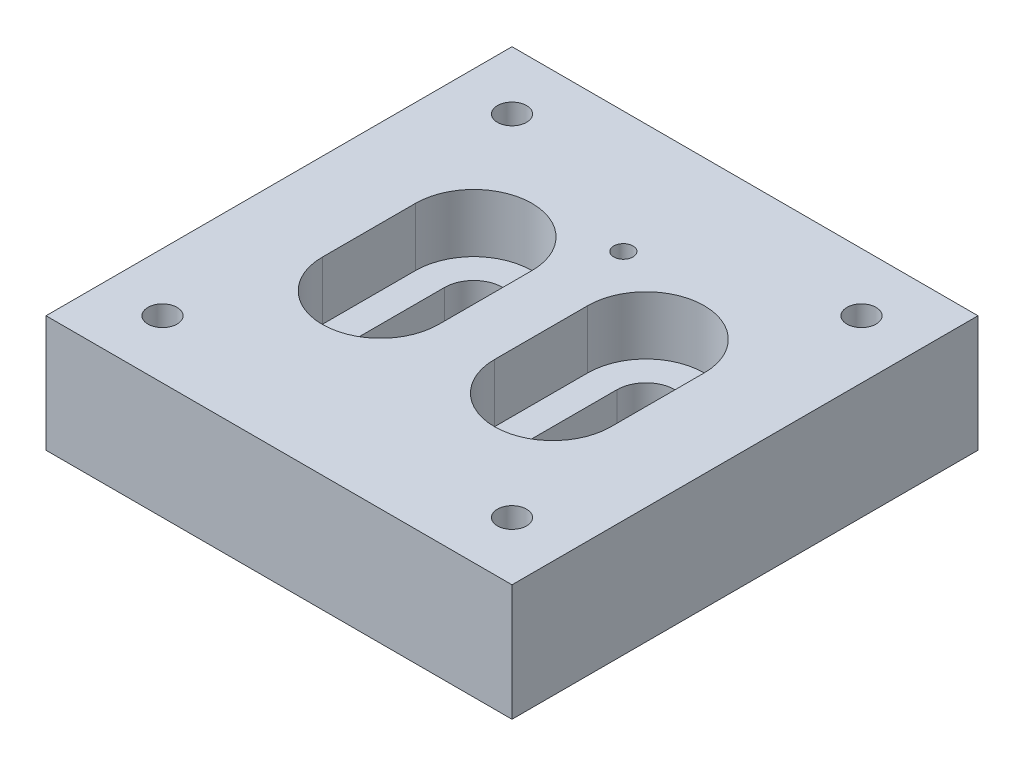
ISO-10303-21;
HEADER;
FILE_DESCRIPTION(('STEP AP214'),'2;1');
FILE_NAME('part.step','',(''),(''),'','','');
FILE_SCHEMA(('AUTOMOTIVE_DESIGN { 1 0 10303 214 1 1 1 1 }'));
ENDSEC;
DATA;
#1=APPLICATION_CONTEXT('core data for automotive mechanical design processes');
#2=APPLICATION_PROTOCOL_DEFINITION('international standard','automotive_design',2000,#1);
#3=PRODUCT_CONTEXT('',#1,'mechanical');
#4=PRODUCT('Part','Part','',(#3));
#5=PRODUCT_RELATED_PRODUCT_CATEGORY('part','',(#4));
#6=PRODUCT_DEFINITION_FORMATION('','',#4);
#7=PRODUCT_DEFINITION_CONTEXT('part definition',#1,'design');
#8=PRODUCT_DEFINITION('design','',#6,#7);
#9=PRODUCT_DEFINITION_SHAPE('','',#8);
#10=(LENGTH_UNIT() NAMED_UNIT(*) SI_UNIT(.MILLI.,.METRE.));
#11=(NAMED_UNIT(*) PLANE_ANGLE_UNIT() SI_UNIT($,.RADIAN.));
#12=(NAMED_UNIT(*) SI_UNIT($,.STERADIAN.) SOLID_ANGLE_UNIT());
#13=UNCERTAINTY_MEASURE_WITH_UNIT(LENGTH_MEASURE(1.E-05),#10,'distance_accuracy_value','');
#14=(GEOMETRIC_REPRESENTATION_CONTEXT(3) GLOBAL_UNCERTAINTY_ASSIGNED_CONTEXT((#13)) GLOBAL_UNIT_ASSIGNED_CONTEXT((#10,
#11,#12)) REPRESENTATION_CONTEXT('',''));
#15=CARTESIAN_POINT('',(0.,0.,0.));
#16=DIRECTION('',(0.,0.,1.));
#17=DIRECTION('',(1.,0.,0.));
#18=AXIS2_PLACEMENT_3D('',#15,#16,#17);
#19=CARTESIAN_POINT('',(0.,20.,0.));
#20=DIRECTION('',(0.,1.,0.));
#21=DIRECTION('',(0.,0.,1.));
#22=AXIS2_PLACEMENT_3D('',#19,#20,#21);
#23=PLANE('',#22);
#24=CARTESIAN_POINT('',(0.,20.,-19.1180830180548));
#25=DIRECTION('',(0.,1.,0.));
#26=DIRECTION('',(0.,0.,1.));
#27=AXIS2_PLACEMENT_3D('',#24,#25,#26);
#28=CIRCLE('',#27,1.65);
#29=CARTESIAN_POINT('',(0.,20.,-17.4680830180548));
#30=VERTEX_POINT('',#29);
#31=EDGE_CURVE('E740',#30,#30,#28,.T.);
#32=ORIENTED_EDGE('',*,*,#31,.F.);
#33=EDGE_LOOP('',(#32));
#34=FACE_BOUND('',#33,.T.);
#35=CARTESIAN_POINT('',(-15.,20.,7.57383044519783));
#36=DIRECTION('',(0.,1.,0.));
#37=DIRECTION('',(0.,0.,1.));
#38=AXIS2_PLACEMENT_3D('',#35,#36,#37);
#39=CIRCLE('',#38,10.);
#40=CARTESIAN_POINT('',(-25.,20.,7.57383044519782));
#41=VERTEX_POINT('',#40);
#42=CARTESIAN_POINT('',(-5.,20.,7.57383044519782));
#43=VERTEX_POINT('',#42);
#44=EDGE_CURVE('E189',#41,#43,#39,.T.);
#45=ORIENTED_EDGE('',*,*,#44,.F.);
#46=DIRECTION('',(0.,0.,1.));
#47=VECTOR('',#46,1.);
#48=CARTESIAN_POINT('',(-25.,20.,-8.42616955480218));
#49=LINE('',#48,#47);
#50=CARTESIAN_POINT('',(-25.,20.,-8.42616955480218));
#51=VERTEX_POINT('',#50);
#52=EDGE_CURVE('E52',#51,#41,#49,.T.);
#53=ORIENTED_EDGE('',*,*,#52,.F.);
#54=CARTESIAN_POINT('',(-15.,20.,-8.42616955480218));
#55=DIRECTION('',(0.,1.,0.));
#56=DIRECTION('',(0.,0.,1.));
#57=AXIS2_PLACEMENT_3D('',#54,#55,#56);
#58=CIRCLE('',#57,10.);
#59=CARTESIAN_POINT('',(-5.,20.,-8.42616955480218));
#60=VERTEX_POINT('',#59);
#61=EDGE_CURVE('E198',#60,#51,#58,.T.);
#62=ORIENTED_EDGE('',*,*,#61,.F.);
#63=DIRECTION('',(0.,0.,-1.));
#64=VECTOR('',#63,1.);
#65=CARTESIAN_POINT('',(-5.,20.,7.57383044519782));
#66=LINE('',#65,#64);
#67=EDGE_CURVE('E182',#43,#60,#66,.T.);
#68=ORIENTED_EDGE('',*,*,#67,.F.);
#69=EDGE_LOOP('',(#45,#53,#62,#68));
#70=FACE_BOUND('',#69,.T.);
#71=CARTESIAN_POINT('',(15.,20.,-8.));
#72=DIRECTION('',(0.,1.,0.));
#73=DIRECTION('',(0.,0.,1.));
#74=AXIS2_PLACEMENT_3D('',#71,#72,#73);
#75=CIRCLE('',#74,10.);
#76=CARTESIAN_POINT('',(25.,20.,-8.));
#77=VERTEX_POINT('',#76);
#78=CARTESIAN_POINT('',(4.99999999999999,20.,-8.));
#79=VERTEX_POINT('',#78);
#80=EDGE_CURVE('E209',#77,#79,#75,.T.);
#81=ORIENTED_EDGE('',*,*,#80,.F.);
#82=DIRECTION('',(0.,0.,-1.));
#83=VECTOR('',#82,1.);
#84=CARTESIAN_POINT('',(25.,20.,8.));
#85=LINE('',#84,#83);
#86=CARTESIAN_POINT('',(25.,20.,8.));
#87=VERTEX_POINT('',#86);
#88=EDGE_CURVE('E60',#87,#77,#85,.T.);
#89=ORIENTED_EDGE('',*,*,#88,.F.);
#90=CARTESIAN_POINT('',(15.,20.,8.));
#91=DIRECTION('',(0.,1.,0.));
#92=DIRECTION('',(0.,0.,1.));
#93=AXIS2_PLACEMENT_3D('',#90,#91,#92);
#94=CIRCLE('',#93,10.);
#95=CARTESIAN_POINT('',(4.99999999999999,20.,8.));
#96=VERTEX_POINT('',#95);
#97=EDGE_CURVE('E266',#96,#87,#94,.T.);
#98=ORIENTED_EDGE('',*,*,#97,.F.);
#99=DIRECTION('',(0.,0.,1.));
#100=VECTOR('',#99,1.);
#101=CARTESIAN_POINT('',(4.99999999999999,20.,-8.));
#102=LINE('',#101,#100);
#103=EDGE_CURVE('E249',#79,#96,#102,.T.);
#104=ORIENTED_EDGE('',*,*,#103,.F.);
#105=EDGE_LOOP('',(#81,#89,#98,#104));
#106=FACE_BOUND('',#105,.T.);
#107=CARTESIAN_POINT('',(-30.,20.,30.));
#108=DIRECTION('',(0.,1.,0.));
#109=DIRECTION('',(0.,0.,1.));
#110=AXIS2_PLACEMENT_3D('',#107,#108,#109);
#111=CIRCLE('',#110,2.5);
#112=CARTESIAN_POINT('',(-30.,20.,32.5));
#113=VERTEX_POINT('',#112);
#114=EDGE_CURVE('E357',#113,#113,#111,.T.);
#115=ORIENTED_EDGE('',*,*,#114,.F.);
#116=EDGE_LOOP('',(#115));
#117=FACE_BOUND('',#116,.T.);
#118=CARTESIAN_POINT('',(-30.,20.,-30.));
#119=DIRECTION('',(0.,1.,0.));
#120=DIRECTION('',(0.,0.,1.));
#121=AXIS2_PLACEMENT_3D('',#118,#119,#120);
#122=CIRCLE('',#121,2.5);
#123=CARTESIAN_POINT('',(-30.,20.,-27.5));
#124=VERTEX_POINT('',#123);
#125=EDGE_CURVE('E369',#124,#124,#122,.T.);
#126=ORIENTED_EDGE('',*,*,#125,.F.);
#127=EDGE_LOOP('',(#126));
#128=FACE_BOUND('',#127,.T.);
#129=DIRECTION('',(0.,0.,-1.));
#130=VECTOR('',#129,1.);
#131=CARTESIAN_POINT('',(40.,20.,-40.));
#132=LINE('',#131,#130);
#133=CARTESIAN_POINT('',(40.,20.,40.));
#134=VERTEX_POINT('',#133);
#135=CARTESIAN_POINT('',(40.,20.,-40.));
#136=VERTEX_POINT('',#135);
#137=EDGE_CURVE('E375',#134,#136,#132,.T.);
#138=ORIENTED_EDGE('',*,*,#137,.T.);
#139=DIRECTION('',(-1.,0.,0.));
#140=VECTOR('',#139,1.);
#141=CARTESIAN_POINT('',(-40.,20.,-40.));
#142=LINE('',#141,#140);
#143=CARTESIAN_POINT('',(-40.,20.,-40.));
#144=VERTEX_POINT('',#143);
#145=EDGE_CURVE('E378',#136,#144,#142,.T.);
#146=ORIENTED_EDGE('',*,*,#145,.T.);
#147=DIRECTION('',(0.,0.,1.));
#148=VECTOR('',#147,1.);
#149=CARTESIAN_POINT('',(-40.,20.,-40.));
#150=LINE('',#149,#148);
#151=CARTESIAN_POINT('',(-40.,20.,40.));
#152=VERTEX_POINT('',#151);
#153=EDGE_CURVE('E381',#144,#152,#150,.T.);
#154=ORIENTED_EDGE('',*,*,#153,.T.);
#155=DIRECTION('',(1.,0.,0.));
#156=VECTOR('',#155,1.);
#157=CARTESIAN_POINT('',(-40.,20.,40.));
#158=LINE('',#157,#156);
#159=EDGE_CURVE('E383',#152,#134,#158,.T.);
#160=ORIENTED_EDGE('',*,*,#159,.T.);
#161=EDGE_LOOP('',(#138,#146,#154,#160));
#162=FACE_BOUND('',#161,.T.);
#163=CARTESIAN_POINT('',(30.,20.,-30.));
#164=DIRECTION('',(0.,1.,0.));
#165=DIRECTION('',(0.,0.,1.));
#166=AXIS2_PLACEMENT_3D('',#163,#164,#165);
#167=CIRCLE('',#166,2.5);
#168=CARTESIAN_POINT('',(30.,20.,-27.5));
#169=VERTEX_POINT('',#168);
#170=EDGE_CURVE('E363',#169,#169,#167,.T.);
#171=ORIENTED_EDGE('',*,*,#170,.F.);
#172=EDGE_LOOP('',(#171));
#173=FACE_BOUND('',#172,.T.);
#174=CARTESIAN_POINT('',(30.,20.,30.));
#175=DIRECTION('',(0.,1.,0.));
#176=DIRECTION('',(0.,0.,1.));
#177=AXIS2_PLACEMENT_3D('',#174,#175,#176);
#178=CIRCLE('',#177,2.5);
#179=CARTESIAN_POINT('',(30.,20.,32.5));
#180=VERTEX_POINT('',#179);
#181=EDGE_CURVE('E351',#180,#180,#178,.T.);
#182=ORIENTED_EDGE('',*,*,#181,.F.);
#183=EDGE_LOOP('',(#182));
#184=FACE_BOUND('',#183,.T.);
#185=ADVANCED_FACE('F37',(#34,#70,#106,#117,#128,#162,#173,#184),#23,.T.);
#186=CARTESIAN_POINT('',(0.,0.,0.));
#187=DIRECTION('',(0.,1.,0.));
#188=DIRECTION('',(0.,0.,1.));
#189=AXIS2_PLACEMENT_3D('',#186,#187,#188);
#190=PLANE('',#189);
#191=CARTESIAN_POINT('',(0.,0.,-19.1180830180548));
#192=DIRECTION('',(0.,1.,0.));
#193=DIRECTION('',(0.,0.,1.));
#194=AXIS2_PLACEMENT_3D('',#191,#192,#193);
#195=CIRCLE('',#194,1.64999999999999);
#196=CARTESIAN_POINT('',(0.,0.,-17.4680830180548));
#197=VERTEX_POINT('',#196);
#198=EDGE_CURVE('E259',#197,#197,#195,.T.);
#199=ORIENTED_EDGE('',*,*,#198,.T.);
#200=EDGE_LOOP('',(#199));
#201=FACE_BOUND('',#200,.T.);
#202=DIRECTION('',(0.,0.,-1.));
#203=VECTOR('',#202,1.);
#204=CARTESIAN_POINT('',(-10.,0.,-8.42616955480218));
#205=LINE('',#204,#203);
#206=CARTESIAN_POINT('',(-10.,0.,7.57383044519782));
#207=VERTEX_POINT('',#206);
#208=CARTESIAN_POINT('',(-10.,0.,-8.42616955480218));
#209=VERTEX_POINT('',#208);
#210=EDGE_CURVE('E313',#207,#209,#205,.T.);
#211=ORIENTED_EDGE('',*,*,#210,.T.);
#212=CARTESIAN_POINT('',(-15.,0.,-8.42616955480218));
#213=DIRECTION('',(0.,1.,0.));
#214=DIRECTION('',(0.,0.,1.));
#215=AXIS2_PLACEMENT_3D('',#212,#213,#214);
#216=CIRCLE('',#215,5.);
#217=CARTESIAN_POINT('',(-20.,0.,-8.42616955480217));
#218=VERTEX_POINT('',#217);
#219=EDGE_CURVE('E303',#209,#218,#216,.T.);
#220=ORIENTED_EDGE('',*,*,#219,.T.);
#221=DIRECTION('',(0.,0.,1.));
#222=VECTOR('',#221,1.);
#223=CARTESIAN_POINT('',(-20.,0.,-8.42616955480217));
#224=LINE('',#223,#222);
#225=CARTESIAN_POINT('',(-20.,0.,7.57383044519782));
#226=VERTEX_POINT('',#225);
#227=EDGE_CURVE('E306',#218,#226,#224,.T.);
#228=ORIENTED_EDGE('',*,*,#227,.T.);
#229=CARTESIAN_POINT('',(-15.,0.,7.57383044519783));
#230=DIRECTION('',(0.,1.,0.));
#231=DIRECTION('',(0.,0.,1.));
#232=AXIS2_PLACEMENT_3D('',#229,#230,#231);
#233=CIRCLE('',#232,5.);
#234=EDGE_CURVE('E310',#226,#207,#233,.T.);
#235=ORIENTED_EDGE('',*,*,#234,.T.);
#236=EDGE_LOOP('',(#211,#220,#228,#235));
#237=FACE_BOUND('',#236,.T.);
#238=DIRECTION('',(0.,0.,-1.));
#239=VECTOR('',#238,1.);
#240=CARTESIAN_POINT('',(20.,0.,-8.));
#241=LINE('',#240,#239);
#242=CARTESIAN_POINT('',(20.,0.,8.));
#243=VERTEX_POINT('',#242);
#244=CARTESIAN_POINT('',(20.,0.,-8.));
#245=VERTEX_POINT('',#244);
#246=EDGE_CURVE('E337',#243,#245,#241,.T.);
#247=ORIENTED_EDGE('',*,*,#246,.T.);
#248=CARTESIAN_POINT('',(15.,0.,-8.));
#249=DIRECTION('',(0.,1.,0.));
#250=DIRECTION('',(0.,0.,1.));
#251=AXIS2_PLACEMENT_3D('',#248,#249,#250);
#252=CIRCLE('',#251,5.00000000000001);
#253=CARTESIAN_POINT('',(9.99999999999999,0.,-8.));
#254=VERTEX_POINT('',#253);
#255=EDGE_CURVE('E302',#245,#254,#252,.T.);
#256=ORIENTED_EDGE('',*,*,#255,.T.);
#257=DIRECTION('',(0.,0.,1.));
#258=VECTOR('',#257,1.);
#259=CARTESIAN_POINT('',(9.99999999999999,0.,-8.));
#260=LINE('',#259,#258);
#261=CARTESIAN_POINT('',(9.99999999999999,0.,8.));
#262=VERTEX_POINT('',#261);
#263=EDGE_CURVE('E331',#254,#262,#260,.T.);
#264=ORIENTED_EDGE('',*,*,#263,.T.);
#265=CARTESIAN_POINT('',(15.,0.,8.));
#266=DIRECTION('',(0.,1.,0.));
#267=DIRECTION('',(0.,0.,1.));
#268=AXIS2_PLACEMENT_3D('',#265,#266,#267);
#269=CIRCLE('',#268,5.00000000000001);
#270=EDGE_CURVE('E334',#262,#243,#269,.T.);
#271=ORIENTED_EDGE('',*,*,#270,.T.);
#272=EDGE_LOOP('',(#247,#256,#264,#271));
#273=FACE_BOUND('',#272,.T.);
#274=DIRECTION('',(0.,0.,-1.));
#275=VECTOR('',#274,1.);
#276=CARTESIAN_POINT('',(40.,0.,-40.));
#277=LINE('',#276,#275);
#278=CARTESIAN_POINT('',(40.,0.,40.));
#279=VERTEX_POINT('',#278);
#280=CARTESIAN_POINT('',(40.,0.,-40.));
#281=VERTEX_POINT('',#280);
#282=EDGE_CURVE('E372',#279,#281,#277,.T.);
#283=ORIENTED_EDGE('',*,*,#282,.F.);
#284=DIRECTION('',(1.,0.,0.));
#285=VECTOR('',#284,1.);
#286=CARTESIAN_POINT('',(-40.,0.,40.));
#287=LINE('',#286,#285);
#288=CARTESIAN_POINT('',(-40.,0.,40.));
#289=VERTEX_POINT('',#288);
#290=EDGE_CURVE('E379',#289,#279,#287,.T.);
#291=ORIENTED_EDGE('',*,*,#290,.F.);
#292=DIRECTION('',(0.,0.,1.));
#293=VECTOR('',#292,1.);
#294=CARTESIAN_POINT('',(-40.,0.,-40.));
#295=LINE('',#294,#293);
#296=CARTESIAN_POINT('',(-40.,0.,-40.));
#297=VERTEX_POINT('',#296);
#298=EDGE_CURVE('E390',#297,#289,#295,.T.);
#299=ORIENTED_EDGE('',*,*,#298,.F.);
#300=DIRECTION('',(-1.,0.,0.));
#301=VECTOR('',#300,1.);
#302=CARTESIAN_POINT('',(-40.,0.,-40.));
#303=LINE('',#302,#301);
#304=EDGE_CURVE('E388',#281,#297,#303,.T.);
#305=ORIENTED_EDGE('',*,*,#304,.F.);
#306=EDGE_LOOP('',(#283,#291,#299,#305));
#307=FACE_BOUND('',#306,.T.);
#308=CARTESIAN_POINT('',(-30.,0.,-30.));
#309=DIRECTION('',(0.,1.,0.));
#310=DIRECTION('',(0.,0.,1.));
#311=AXIS2_PLACEMENT_3D('',#308,#309,#310);
#312=CIRCLE('',#311,2.5);
#313=CARTESIAN_POINT('',(-30.,0.,-27.5));
#314=VERTEX_POINT('',#313);
#315=EDGE_CURVE('E366',#314,#314,#312,.T.);
#316=ORIENTED_EDGE('',*,*,#315,.T.);
#317=EDGE_LOOP('',(#316));
#318=FACE_BOUND('',#317,.T.);
#319=CARTESIAN_POINT('',(30.,0.,-30.));
#320=DIRECTION('',(0.,1.,0.));
#321=DIRECTION('',(0.,0.,1.));
#322=AXIS2_PLACEMENT_3D('',#319,#320,#321);
#323=CIRCLE('',#322,2.5);
#324=CARTESIAN_POINT('',(30.,0.,-27.5));
#325=VERTEX_POINT('',#324);
#326=EDGE_CURVE('E360',#325,#325,#323,.T.);
#327=ORIENTED_EDGE('',*,*,#326,.T.);
#328=EDGE_LOOP('',(#327));
#329=FACE_BOUND('',#328,.T.);
#330=CARTESIAN_POINT('',(-30.,0.,30.));
#331=DIRECTION('',(0.,1.,0.));
#332=DIRECTION('',(0.,0.,1.));
#333=AXIS2_PLACEMENT_3D('',#330,#331,#332);
#334=CIRCLE('',#333,2.5);
#335=CARTESIAN_POINT('',(-30.,0.,32.5));
#336=VERTEX_POINT('',#335);
#337=EDGE_CURVE('E354',#336,#336,#334,.T.);
#338=ORIENTED_EDGE('',*,*,#337,.T.);
#339=EDGE_LOOP('',(#338));
#340=FACE_BOUND('',#339,.T.);
#341=CARTESIAN_POINT('',(30.,0.,30.));
#342=DIRECTION('',(0.,1.,0.));
#343=DIRECTION('',(0.,0.,1.));
#344=AXIS2_PLACEMENT_3D('',#341,#342,#343);
#345=CIRCLE('',#344,2.5);
#346=CARTESIAN_POINT('',(30.,0.,32.5));
#347=VERTEX_POINT('',#346);
#348=EDGE_CURVE('E320',#347,#347,#345,.T.);
#349=ORIENTED_EDGE('',*,*,#348,.T.);
#350=EDGE_LOOP('',(#349));
#351=FACE_BOUND('',#350,.T.);
#352=ADVANCED_FACE('F413',(#201,#237,#273,#307,#318,#329,#340,#351),#190,.F.);
#353=CARTESIAN_POINT('',(40.,20.,-40.));
#354=DIRECTION('',(-1.,0.,0.));
#355=DIRECTION('',(0.,0.,1.));
#356=AXIS2_PLACEMENT_3D('',#353,#354,#355);
#357=PLANE('',#356);
#358=ORIENTED_EDGE('',*,*,#282,.T.);
#359=DIRECTION('',(0.,-1.,0.));
#360=VECTOR('',#359,1.);
#361=CARTESIAN_POINT('',(40.,20.,-40.));
#362=LINE('',#361,#360);
#363=EDGE_CURVE('E401',#136,#281,#362,.T.);
#364=ORIENTED_EDGE('',*,*,#363,.F.);
#365=ORIENTED_EDGE('',*,*,#137,.F.);
#366=DIRECTION('',(0.,-1.,0.));
#367=VECTOR('',#366,1.);
#368=CARTESIAN_POINT('',(40.,20.,40.));
#369=LINE('',#368,#367);
#370=EDGE_CURVE('E385',#134,#279,#369,.T.);
#371=ORIENTED_EDGE('',*,*,#370,.T.);
#372=EDGE_LOOP('',(#358,#364,#365,#371));
#373=FACE_BOUND('',#372,.T.);
#374=ADVANCED_FACE('F39',(#373),#357,.F.);
#375=CARTESIAN_POINT('',(-40.,20.,-40.));
#376=DIRECTION('',(0.,0.,1.));
#377=DIRECTION('',(1.,0.,0.));
#378=AXIS2_PLACEMENT_3D('',#375,#376,#377);
#379=PLANE('',#378);
#380=ORIENTED_EDGE('',*,*,#304,.T.);
#381=DIRECTION('',(0.,-1.,0.));
#382=VECTOR('',#381,1.);
#383=CARTESIAN_POINT('',(-40.,20.,-40.));
#384=LINE('',#383,#382);
#385=EDGE_CURVE('E398',#144,#297,#384,.T.);
#386=ORIENTED_EDGE('',*,*,#385,.F.);
#387=ORIENTED_EDGE('',*,*,#145,.F.);
#388=ORIENTED_EDGE('',*,*,#363,.T.);
#389=EDGE_LOOP('',(#380,#386,#387,#388));
#390=FACE_BOUND('',#389,.T.);
#391=ADVANCED_FACE('F450',(#390),#379,.F.);
#392=CARTESIAN_POINT('',(-40.,20.,-40.));
#393=DIRECTION('',(1.,0.,0.));
#394=DIRECTION('',(0.,0.,-1.));
#395=AXIS2_PLACEMENT_3D('',#392,#393,#394);
#396=PLANE('',#395);
#397=ORIENTED_EDGE('',*,*,#298,.T.);
#398=DIRECTION('',(0.,-1.,0.));
#399=VECTOR('',#398,1.);
#400=CARTESIAN_POINT('',(-40.,20.,40.));
#401=LINE('',#400,#399);
#402=EDGE_CURVE('E395',#152,#289,#401,.T.);
#403=ORIENTED_EDGE('',*,*,#402,.F.);
#404=ORIENTED_EDGE('',*,*,#153,.F.);
#405=ORIENTED_EDGE('',*,*,#385,.T.);
#406=EDGE_LOOP('',(#397,#403,#404,#405));
#407=FACE_BOUND('',#406,.T.);
#408=ADVANCED_FACE('F447',(#407),#396,.F.);
#409=CARTESIAN_POINT('',(-40.,20.,40.));
#410=DIRECTION('',(0.,0.,-1.));
#411=DIRECTION('',(-1.,0.,0.));
#412=AXIS2_PLACEMENT_3D('',#409,#410,#411);
#413=PLANE('',#412);
#414=ORIENTED_EDGE('',*,*,#290,.T.);
#415=ORIENTED_EDGE('',*,*,#370,.F.);
#416=ORIENTED_EDGE('',*,*,#159,.F.);
#417=ORIENTED_EDGE('',*,*,#402,.T.);
#418=EDGE_LOOP('',(#414,#415,#416,#417));
#419=FACE_BOUND('',#418,.T.);
#420=ADVANCED_FACE('F444',(#419),#413,.F.);
#421=CARTESIAN_POINT('',(-30.,20.,-30.));
#422=DIRECTION('',(0.,-1.,0.));
#423=DIRECTION('',(0.,0.,-1.));
#424=AXIS2_PLACEMENT_3D('',#421,#422,#423);
#425=CYLINDRICAL_SURFACE('',#424,2.5);
#426=ORIENTED_EDGE('',*,*,#125,.T.);
#427=EDGE_LOOP('',(#426));
#428=FACE_BOUND('',#427,.T.);
#429=ORIENTED_EDGE('',*,*,#315,.F.);
#430=EDGE_LOOP('',(#429));
#431=FACE_BOUND('',#430,.T.);
#432=ADVANCED_FACE('F441',(#428,#431),#425,.F.);
#433=CARTESIAN_POINT('',(30.,20.,-30.));
#434=DIRECTION('',(0.,-1.,0.));
#435=DIRECTION('',(0.,0.,-1.));
#436=AXIS2_PLACEMENT_3D('',#433,#434,#435);
#437=CYLINDRICAL_SURFACE('',#436,2.5);
#438=ORIENTED_EDGE('',*,*,#170,.T.);
#439=EDGE_LOOP('',(#438));
#440=FACE_BOUND('',#439,.T.);
#441=ORIENTED_EDGE('',*,*,#326,.F.);
#442=EDGE_LOOP('',(#441));
#443=FACE_BOUND('',#442,.T.);
#444=ADVANCED_FACE('F491',(#440,#443),#437,.F.);
#445=CARTESIAN_POINT('',(-30.,20.,30.));
#446=DIRECTION('',(0.,-1.,0.));
#447=DIRECTION('',(0.,0.,-1.));
#448=AXIS2_PLACEMENT_3D('',#445,#446,#447);
#449=CYLINDRICAL_SURFACE('',#448,2.5);
#450=ORIENTED_EDGE('',*,*,#114,.T.);
#451=EDGE_LOOP('',(#450));
#452=FACE_BOUND('',#451,.T.);
#453=ORIENTED_EDGE('',*,*,#337,.F.);
#454=EDGE_LOOP('',(#453));
#455=FACE_BOUND('',#454,.T.);
#456=ADVANCED_FACE('F480',(#452,#455),#449,.F.);
#457=CARTESIAN_POINT('',(30.,20.,30.));
#458=DIRECTION('',(0.,-1.,0.));
#459=DIRECTION('',(0.,0.,-1.));
#460=AXIS2_PLACEMENT_3D('',#457,#458,#459);
#461=CYLINDRICAL_SURFACE('',#460,2.5);
#462=ORIENTED_EDGE('',*,*,#181,.T.);
#463=EDGE_LOOP('',(#462));
#464=FACE_BOUND('',#463,.T.);
#465=ORIENTED_EDGE('',*,*,#348,.F.);
#466=EDGE_LOOP('',(#465));
#467=FACE_BOUND('',#466,.T.);
#468=ADVANCED_FACE('F476',(#464,#467),#461,.F.);
#469=CARTESIAN_POINT('',(15.,0.,-8.));
#470=DIRECTION('',(0.,1.,0.));
#471=DIRECTION('',(0.,0.,1.));
#472=AXIS2_PLACEMENT_3D('',#469,#470,#471);
#473=CYLINDRICAL_SURFACE('',#472,5.00000000000001);
#474=DIRECTION('',(0.,1.,0.));
#475=VECTOR('',#474,1.);
#476=CARTESIAN_POINT('',(20.,0.,-8.));
#477=LINE('',#476,#475);
#478=CARTESIAN_POINT('',(20.,10.,-8.));
#479=VERTEX_POINT('',#478);
#480=EDGE_CURVE('E307',#245,#479,#477,.T.);
#481=ORIENTED_EDGE('',*,*,#480,.T.);
#482=CARTESIAN_POINT('',(15.,10.,-8.));
#483=DIRECTION('',(0.,-1.,0.));
#484=DIRECTION('',(0.,0.,-1.));
#485=AXIS2_PLACEMENT_3D('',#482,#483,#484);
#486=CIRCLE('',#485,5.00000000000001);
#487=CARTESIAN_POINT('',(9.99999999999999,10.,-8.));
#488=VERTEX_POINT('',#487);
#489=EDGE_CURVE('E299',#479,#488,#486,.F.);
#490=ORIENTED_EDGE('',*,*,#489,.T.);
#491=DIRECTION('',(0.,1.,0.));
#492=VECTOR('',#491,1.);
#493=CARTESIAN_POINT('',(9.99999999999999,0.,-8.));
#494=LINE('',#493,#492);
#495=EDGE_CURVE('E340',#254,#488,#494,.T.);
#496=ORIENTED_EDGE('',*,*,#495,.F.);
#497=ORIENTED_EDGE('',*,*,#255,.F.);
#498=EDGE_LOOP('',(#481,#490,#496,#497));
#499=FACE_BOUND('',#498,.T.);
#500=ADVANCED_FACE('F479',(#499),#473,.F.);
#501=CARTESIAN_POINT('',(20.,0.,-8.));
#502=DIRECTION('',(1.,0.,0.));
#503=DIRECTION('',(0.,0.,-1.));
#504=AXIS2_PLACEMENT_3D('',#501,#502,#503);
#505=PLANE('',#504);
#506=DIRECTION('',(0.,1.,0.));
#507=VECTOR('',#506,1.);
#508=CARTESIAN_POINT('',(20.,0.,8.));
#509=LINE('',#508,#507);
#510=CARTESIAN_POINT('',(20.,10.,8.));
#511=VERTEX_POINT('',#510);
#512=EDGE_CURVE('E343',#243,#511,#509,.T.);
#513=ORIENTED_EDGE('',*,*,#512,.T.);
#514=DIRECTION('',(0.,0.,-1.));
#515=VECTOR('',#514,1.);
#516=CARTESIAN_POINT('',(20.,10.,-8.));
#517=LINE('',#516,#515);
#518=EDGE_CURVE('E296',#511,#479,#517,.T.);
#519=ORIENTED_EDGE('',*,*,#518,.T.);
#520=ORIENTED_EDGE('',*,*,#480,.F.);
#521=ORIENTED_EDGE('',*,*,#246,.F.);
#522=EDGE_LOOP('',(#513,#519,#520,#521));
#523=FACE_BOUND('',#522,.T.);
#524=ADVANCED_FACE('F488',(#523),#505,.F.);
#525=CARTESIAN_POINT('',(15.,0.,8.));
#526=DIRECTION('',(0.,1.,0.));
#527=DIRECTION('',(0.,0.,1.));
#528=AXIS2_PLACEMENT_3D('',#525,#526,#527);
#529=CYLINDRICAL_SURFACE('',#528,5.00000000000001);
#530=DIRECTION('',(0.,1.,0.));
#531=VECTOR('',#530,1.);
#532=CARTESIAN_POINT('',(9.99999999999999,0.,8.));
#533=LINE('',#532,#531);
#534=CARTESIAN_POINT('',(9.99999999999999,10.,8.));
#535=VERTEX_POINT('',#534);
#536=EDGE_CURVE('E346',#262,#535,#533,.T.);
#537=ORIENTED_EDGE('',*,*,#536,.T.);
#538=CARTESIAN_POINT('',(15.,10.,8.));
#539=DIRECTION('',(0.,-1.,0.));
#540=DIRECTION('',(0.,0.,-1.));
#541=AXIS2_PLACEMENT_3D('',#538,#539,#540);
#542=CIRCLE('',#541,5.00000000000001);
#543=EDGE_CURVE('E293',#535,#511,#542,.F.);
#544=ORIENTED_EDGE('',*,*,#543,.T.);
#545=ORIENTED_EDGE('',*,*,#512,.F.);
#546=ORIENTED_EDGE('',*,*,#270,.F.);
#547=EDGE_LOOP('',(#537,#544,#545,#546));
#548=FACE_BOUND('',#547,.T.);
#549=ADVANCED_FACE('F654',(#548),#529,.F.);
#550=CARTESIAN_POINT('',(9.99999999999999,0.,-8.));
#551=DIRECTION('',(-1.,0.,0.));
#552=DIRECTION('',(0.,0.,1.));
#553=AXIS2_PLACEMENT_3D('',#550,#551,#552);
#554=PLANE('',#553);
#555=ORIENTED_EDGE('',*,*,#495,.T.);
#556=DIRECTION('',(0.,0.,1.));
#557=VECTOR('',#556,1.);
#558=CARTESIAN_POINT('',(9.99999999999999,10.,-8.));
#559=LINE('',#558,#557);
#560=EDGE_CURVE('E12',#488,#535,#559,.T.);
#561=ORIENTED_EDGE('',*,*,#560,.T.);
#562=ORIENTED_EDGE('',*,*,#536,.F.);
#563=ORIENTED_EDGE('',*,*,#263,.F.);
#564=EDGE_LOOP('',(#555,#561,#562,#563));
#565=FACE_BOUND('',#564,.T.);
#566=ADVANCED_FACE('F428',(#565),#554,.F.);
#567=CARTESIAN_POINT('',(-15.,0.,-8.42616955480218));
#568=DIRECTION('',(0.,1.,0.));
#569=DIRECTION('',(0.,0.,1.));
#570=AXIS2_PLACEMENT_3D('',#567,#568,#569);
#571=CYLINDRICAL_SURFACE('',#570,5.);
#572=DIRECTION('',(0.,1.,0.));
#573=VECTOR('',#572,1.);
#574=CARTESIAN_POINT('',(-10.,0.,-8.42616955480218));
#575=LINE('',#574,#573);
#576=CARTESIAN_POINT('',(-10.,10.,-8.42616955480218));
#577=VERTEX_POINT('',#576);
#578=EDGE_CURVE('E317',#209,#577,#575,.T.);
#579=ORIENTED_EDGE('',*,*,#578,.T.);
#580=CARTESIAN_POINT('',(-15.,10.,-8.42616955480218));
#581=DIRECTION('',(0.,-1.,0.));
#582=DIRECTION('',(0.,0.,-1.));
#583=AXIS2_PLACEMENT_3D('',#580,#581,#582);
#584=CIRCLE('',#583,5.);
#585=CARTESIAN_POINT('',(-20.,10.,-8.42616955480217));
#586=VERTEX_POINT('',#585);
#587=EDGE_CURVE('E290',#577,#586,#584,.F.);
#588=ORIENTED_EDGE('',*,*,#587,.T.);
#589=DIRECTION('',(0.,1.,0.));
#590=VECTOR('',#589,1.);
#591=CARTESIAN_POINT('',(-20.,0.,-8.42616955480217));
#592=LINE('',#591,#590);
#593=EDGE_CURVE('E316',#218,#586,#592,.T.);
#594=ORIENTED_EDGE('',*,*,#593,.F.);
#595=ORIENTED_EDGE('',*,*,#219,.F.);
#596=EDGE_LOOP('',(#579,#588,#594,#595));
#597=FACE_BOUND('',#596,.T.);
#598=ADVANCED_FACE('F417',(#597),#571,.F.);
#599=CARTESIAN_POINT('',(-10.,0.,-8.42616955480218));
#600=DIRECTION('',(1.,0.,0.));
#601=DIRECTION('',(0.,0.,-1.));
#602=AXIS2_PLACEMENT_3D('',#599,#600,#601);
#603=PLANE('',#602);
#604=DIRECTION('',(0.,1.,0.));
#605=VECTOR('',#604,1.);
#606=CARTESIAN_POINT('',(-10.,0.,7.57383044519782));
#607=LINE('',#606,#605);
#608=CARTESIAN_POINT('',(-10.,10.,7.57383044519782));
#609=VERTEX_POINT('',#608);
#610=EDGE_CURVE('E321',#207,#609,#607,.T.);
#611=ORIENTED_EDGE('',*,*,#610,.T.);
#612=DIRECTION('',(0.,0.,-1.));
#613=VECTOR('',#612,1.);
#614=CARTESIAN_POINT('',(-10.,10.,-8.42616955480218));
#615=LINE('',#614,#613);
#616=EDGE_CURVE('E287',#609,#577,#615,.T.);
#617=ORIENTED_EDGE('',*,*,#616,.T.);
#618=ORIENTED_EDGE('',*,*,#578,.F.);
#619=ORIENTED_EDGE('',*,*,#210,.F.);
#620=EDGE_LOOP('',(#611,#617,#618,#619));
#621=FACE_BOUND('',#620,.T.);
#622=ADVANCED_FACE('F420',(#621),#603,.F.);
#623=CARTESIAN_POINT('',(-15.,0.,7.57383044519783));
#624=DIRECTION('',(0.,1.,0.));
#625=DIRECTION('',(0.,0.,1.));
#626=AXIS2_PLACEMENT_3D('',#623,#624,#625);
#627=CYLINDRICAL_SURFACE('',#626,5.);
#628=DIRECTION('',(0.,1.,0.));
#629=VECTOR('',#628,1.);
#630=CARTESIAN_POINT('',(-20.,0.,7.57383044519782));
#631=LINE('',#630,#629);
#632=CARTESIAN_POINT('',(-20.,10.,7.57383044519782));
#633=VERTEX_POINT('',#632);
#634=EDGE_CURVE('E324',#226,#633,#631,.T.);
#635=ORIENTED_EDGE('',*,*,#634,.T.);
#636=CARTESIAN_POINT('',(-15.,10.,7.57383044519783));
#637=DIRECTION('',(0.,-1.,0.));
#638=DIRECTION('',(0.,0.,-1.));
#639=AXIS2_PLACEMENT_3D('',#636,#637,#638);
#640=CIRCLE('',#639,5.);
#641=EDGE_CURVE('E193',#633,#609,#640,.F.);
#642=ORIENTED_EDGE('',*,*,#641,.T.);
#643=ORIENTED_EDGE('',*,*,#610,.F.);
#644=ORIENTED_EDGE('',*,*,#234,.F.);
#645=EDGE_LOOP('',(#635,#642,#643,#644));
#646=FACE_BOUND('',#645,.T.);
#647=ADVANCED_FACE('F410',(#646),#627,.F.);
#648=CARTESIAN_POINT('',(-20.,0.,-8.42616955480217));
#649=DIRECTION('',(-1.,0.,0.));
#650=DIRECTION('',(0.,0.,1.));
#651=AXIS2_PLACEMENT_3D('',#648,#649,#650);
#652=PLANE('',#651);
#653=ORIENTED_EDGE('',*,*,#593,.T.);
#654=DIRECTION('',(0.,0.,1.));
#655=VECTOR('',#654,1.);
#656=CARTESIAN_POINT('',(-20.,10.,-8.42616955480217));
#657=LINE('',#656,#655);
#658=EDGE_CURVE('E45',#586,#633,#657,.T.);
#659=ORIENTED_EDGE('',*,*,#658,.T.);
#660=ORIENTED_EDGE('',*,*,#634,.F.);
#661=ORIENTED_EDGE('',*,*,#227,.F.);
#662=EDGE_LOOP('',(#653,#659,#660,#661));
#663=FACE_BOUND('',#662,.T.);
#664=ADVANCED_FACE('F406',(#663),#652,.F.);
#665=CARTESIAN_POINT('',(0.,10.,0.));
#666=DIRECTION('',(0.,-1.,0.));
#667=DIRECTION('',(0.,0.,-1.));
#668=AXIS2_PLACEMENT_3D('',#665,#666,#667);
#669=PLANE('',#668);
#670=CARTESIAN_POINT('',(-15.,10.,7.57383044519783));
#671=DIRECTION('',(0.,1.,0.));
#672=DIRECTION('',(0.,0.,1.));
#673=AXIS2_PLACEMENT_3D('',#670,#671,#672);
#674=CIRCLE('',#673,10.);
#675=CARTESIAN_POINT('',(-25.,10.,7.57383044519782));
#676=VERTEX_POINT('',#675);
#677=CARTESIAN_POINT('',(-5.,10.,7.57383044519782));
#678=VERTEX_POINT('',#677);
#679=EDGE_CURVE('E194',#676,#678,#674,.T.);
#680=ORIENTED_EDGE('',*,*,#679,.T.);
#681=DIRECTION('',(0.,0.,-1.));
#682=VECTOR('',#681,1.);
#683=CARTESIAN_POINT('',(-5.,10.,7.57383044519782));
#684=LINE('',#683,#682);
#685=CARTESIAN_POINT('',(-5.,10.,-8.42616955480218));
#686=VERTEX_POINT('',#685);
#687=EDGE_CURVE('E184',#678,#686,#684,.T.);
#688=ORIENTED_EDGE('',*,*,#687,.T.);
#689=CARTESIAN_POINT('',(-15.,10.,-8.42616955480218));
#690=DIRECTION('',(0.,1.,0.));
#691=DIRECTION('',(0.,0.,1.));
#692=AXIS2_PLACEMENT_3D('',#689,#690,#691);
#693=CIRCLE('',#692,10.);
#694=CARTESIAN_POINT('',(-25.,10.,-8.42616955480218));
#695=VERTEX_POINT('',#694);
#696=EDGE_CURVE('E219',#686,#695,#693,.T.);
#697=ORIENTED_EDGE('',*,*,#696,.T.);
#698=DIRECTION('',(0.,0.,1.));
#699=VECTOR('',#698,1.);
#700=CARTESIAN_POINT('',(-25.,10.,-8.42616955480218));
#701=LINE('',#700,#699);
#702=EDGE_CURVE('E206',#695,#676,#701,.T.);
#703=ORIENTED_EDGE('',*,*,#702,.T.);
#704=EDGE_LOOP('',(#680,#688,#697,#703));
#705=FACE_BOUND('',#704,.T.);
#706=ORIENTED_EDGE('',*,*,#616,.F.);
#707=ORIENTED_EDGE('',*,*,#641,.F.);
#708=ORIENTED_EDGE('',*,*,#658,.F.);
#709=ORIENTED_EDGE('',*,*,#587,.F.);
#710=EDGE_LOOP('',(#706,#707,#708,#709));
#711=FACE_BOUND('',#710,.T.);
#712=ADVANCED_FACE('F418',(#705,#711),#669,.F.);
#713=CARTESIAN_POINT('',(-25.,20.,-8.42616955480218));
#714=DIRECTION('',(1.,0.,0.));
#715=DIRECTION('',(0.,0.,-1.));
#716=AXIS2_PLACEMENT_3D('',#713,#714,#715);
#717=PLANE('',#716);
#718=ORIENTED_EDGE('',*,*,#702,.F.);
#719=DIRECTION('',(0.,-1.,0.));
#720=VECTOR('',#719,1.);
#721=CARTESIAN_POINT('',(-25.,20.,-8.42616955480218));
#722=LINE('',#721,#720);
#723=EDGE_CURVE('E208',#51,#695,#722,.T.);
#724=ORIENTED_EDGE('',*,*,#723,.F.);
#725=ORIENTED_EDGE('',*,*,#52,.T.);
#726=DIRECTION('',(0.,-1.,0.));
#727=VECTOR('',#726,1.);
#728=CARTESIAN_POINT('',(-25.,20.,7.57383044519782));
#729=LINE('',#728,#727);
#730=EDGE_CURVE('E191',#41,#676,#729,.T.);
#731=ORIENTED_EDGE('',*,*,#730,.T.);
#732=EDGE_LOOP('',(#718,#724,#725,#731));
#733=FACE_BOUND('',#732,.T.);
#734=ADVANCED_FACE('F592',(#733),#717,.T.);
#735=CARTESIAN_POINT('',(-15.,20.,-8.42616955480218));
#736=DIRECTION('',(0.,-1.,0.));
#737=DIRECTION('',(0.,0.,-1.));
#738=AXIS2_PLACEMENT_3D('',#735,#736,#737);
#739=CYLINDRICAL_SURFACE('',#738,10.);
#740=ORIENTED_EDGE('',*,*,#696,.F.);
#741=DIRECTION('',(0.,-1.,0.));
#742=VECTOR('',#741,1.);
#743=CARTESIAN_POINT('',(-5.,20.,-8.42616955480218));
#744=LINE('',#743,#742);
#745=EDGE_CURVE('E217',#60,#686,#744,.T.);
#746=ORIENTED_EDGE('',*,*,#745,.F.);
#747=ORIENTED_EDGE('',*,*,#61,.T.);
#748=ORIENTED_EDGE('',*,*,#723,.T.);
#749=EDGE_LOOP('',(#740,#746,#747,#748));
#750=FACE_BOUND('',#749,.T.);
#751=ADVANCED_FACE('F604',(#750),#739,.F.);
#752=CARTESIAN_POINT('',(-5.,20.,7.57383044519782));
#753=DIRECTION('',(-1.,0.,0.));
#754=DIRECTION('',(0.,0.,1.));
#755=AXIS2_PLACEMENT_3D('',#752,#753,#754);
#756=PLANE('',#755);
#757=ORIENTED_EDGE('',*,*,#687,.F.);
#758=DIRECTION('',(0.,-1.,0.));
#759=VECTOR('',#758,1.);
#760=CARTESIAN_POINT('',(-5.,20.,7.57383044519782));
#761=LINE('',#760,#759);
#762=EDGE_CURVE('E177',#43,#678,#761,.T.);
#763=ORIENTED_EDGE('',*,*,#762,.F.);
#764=ORIENTED_EDGE('',*,*,#67,.T.);
#765=ORIENTED_EDGE('',*,*,#745,.T.);
#766=EDGE_LOOP('',(#757,#763,#764,#765));
#767=FACE_BOUND('',#766,.T.);
#768=ADVANCED_FACE('F179',(#767),#756,.T.);
#769=CARTESIAN_POINT('',(-15.,20.,7.57383044519783));
#770=DIRECTION('',(0.,-1.,0.));
#771=DIRECTION('',(0.,0.,-1.));
#772=AXIS2_PLACEMENT_3D('',#769,#770,#771);
#773=CYLINDRICAL_SURFACE('',#772,10.);
#774=ORIENTED_EDGE('',*,*,#679,.F.);
#775=ORIENTED_EDGE('',*,*,#730,.F.);
#776=ORIENTED_EDGE('',*,*,#44,.T.);
#777=ORIENTED_EDGE('',*,*,#762,.T.);
#778=EDGE_LOOP('',(#774,#775,#776,#777));
#779=FACE_BOUND('',#778,.T.);
#780=ADVANCED_FACE('F190',(#779),#773,.F.);
#781=CARTESIAN_POINT('',(0.,10.,0.));
#782=DIRECTION('',(0.,-1.,0.));
#783=DIRECTION('',(0.,0.,-1.));
#784=AXIS2_PLACEMENT_3D('',#781,#782,#783);
#785=PLANE('',#784);
#786=CARTESIAN_POINT('',(15.,10.,-8.));
#787=DIRECTION('',(0.,1.,0.));
#788=DIRECTION('',(0.,0.,1.));
#789=AXIS2_PLACEMENT_3D('',#786,#787,#788);
#790=CIRCLE('',#789,10.);
#791=CARTESIAN_POINT('',(25.,10.,-8.));
#792=VERTEX_POINT('',#791);
#793=CARTESIAN_POINT('',(4.99999999999999,10.,-8.));
#794=VERTEX_POINT('',#793);
#795=EDGE_CURVE('E243',#792,#794,#790,.T.);
#796=ORIENTED_EDGE('',*,*,#795,.T.);
#797=DIRECTION('',(0.,0.,1.));
#798=VECTOR('',#797,1.);
#799=CARTESIAN_POINT('',(4.99999999999999,10.,-8.));
#800=LINE('',#799,#798);
#801=CARTESIAN_POINT('',(4.99999999999999,10.,8.));
#802=VERTEX_POINT('',#801);
#803=EDGE_CURVE('E250',#794,#802,#800,.T.);
#804=ORIENTED_EDGE('',*,*,#803,.T.);
#805=CARTESIAN_POINT('',(15.,10.,8.));
#806=DIRECTION('',(0.,1.,0.));
#807=DIRECTION('',(0.,0.,1.));
#808=AXIS2_PLACEMENT_3D('',#805,#806,#807);
#809=CIRCLE('',#808,10.);
#810=CARTESIAN_POINT('',(25.,10.,8.));
#811=VERTEX_POINT('',#810);
#812=EDGE_CURVE('E234',#802,#811,#809,.T.);
#813=ORIENTED_EDGE('',*,*,#812,.T.);
#814=DIRECTION('',(0.,0.,-1.));
#815=VECTOR('',#814,1.);
#816=CARTESIAN_POINT('',(25.,10.,8.));
#817=LINE('',#816,#815);
#818=EDGE_CURVE('E257',#811,#792,#817,.T.);
#819=ORIENTED_EDGE('',*,*,#818,.T.);
#820=EDGE_LOOP('',(#796,#804,#813,#819));
#821=FACE_BOUND('',#820,.T.);
#822=ORIENTED_EDGE('',*,*,#518,.F.);
#823=ORIENTED_EDGE('',*,*,#543,.F.);
#824=ORIENTED_EDGE('',*,*,#560,.F.);
#825=ORIENTED_EDGE('',*,*,#489,.F.);
#826=EDGE_LOOP('',(#822,#823,#824,#825));
#827=FACE_BOUND('',#826,.T.);
#828=ADVANCED_FACE('F565',(#821,#827),#785,.F.);
#829=CARTESIAN_POINT('',(25.,20.,8.));
#830=DIRECTION('',(-1.,0.,0.));
#831=DIRECTION('',(0.,0.,1.));
#832=AXIS2_PLACEMENT_3D('',#829,#830,#831);
#833=PLANE('',#832);
#834=ORIENTED_EDGE('',*,*,#818,.F.);
#835=DIRECTION('',(0.,-1.,0.));
#836=VECTOR('',#835,1.);
#837=CARTESIAN_POINT('',(25.,20.,8.));
#838=LINE('',#837,#836);
#839=EDGE_CURVE('E238',#87,#811,#838,.T.);
#840=ORIENTED_EDGE('',*,*,#839,.F.);
#841=ORIENTED_EDGE('',*,*,#88,.T.);
#842=DIRECTION('',(0.,-1.,0.));
#843=VECTOR('',#842,1.);
#844=CARTESIAN_POINT('',(25.,20.,-8.));
#845=LINE('',#844,#843);
#846=EDGE_CURVE('E232',#77,#792,#845,.T.);
#847=ORIENTED_EDGE('',*,*,#846,.T.);
#848=EDGE_LOOP('',(#834,#840,#841,#847));
#849=FACE_BOUND('',#848,.T.);
#850=ADVANCED_FACE('F553',(#849),#833,.T.);
#851=CARTESIAN_POINT('',(15.,20.,8.));
#852=DIRECTION('',(0.,-1.,0.));
#853=DIRECTION('',(0.,0.,-1.));
#854=AXIS2_PLACEMENT_3D('',#851,#852,#853);
#855=CYLINDRICAL_SURFACE('',#854,10.);
#856=ORIENTED_EDGE('',*,*,#812,.F.);
#857=DIRECTION('',(0.,-1.,0.));
#858=VECTOR('',#857,1.);
#859=CARTESIAN_POINT('',(4.99999999999999,20.,8.));
#860=LINE('',#859,#858);
#861=EDGE_CURVE('E269',#96,#802,#860,.T.);
#862=ORIENTED_EDGE('',*,*,#861,.F.);
#863=ORIENTED_EDGE('',*,*,#97,.T.);
#864=ORIENTED_EDGE('',*,*,#839,.T.);
#865=EDGE_LOOP('',(#856,#862,#863,#864));
#866=FACE_BOUND('',#865,.T.);
#867=ADVANCED_FACE('F570',(#866),#855,.F.);
#868=CARTESIAN_POINT('',(4.99999999999999,20.,-8.));
#869=DIRECTION('',(1.,0.,0.));
#870=DIRECTION('',(0.,0.,-1.));
#871=AXIS2_PLACEMENT_3D('',#868,#869,#870);
#872=PLANE('',#871);
#873=ORIENTED_EDGE('',*,*,#803,.F.);
#874=DIRECTION('',(0.,-1.,0.));
#875=VECTOR('',#874,1.);
#876=CARTESIAN_POINT('',(4.99999999999999,20.,-8.));
#877=LINE('',#876,#875);
#878=EDGE_CURVE('E246',#79,#794,#877,.T.);
#879=ORIENTED_EDGE('',*,*,#878,.F.);
#880=ORIENTED_EDGE('',*,*,#103,.T.);
#881=ORIENTED_EDGE('',*,*,#861,.T.);
#882=EDGE_LOOP('',(#873,#879,#880,#881));
#883=FACE_BOUND('',#882,.T.);
#884=ADVANCED_FACE('F562',(#883),#872,.T.);
#885=CARTESIAN_POINT('',(15.,20.,-8.));
#886=DIRECTION('',(0.,-1.,0.));
#887=DIRECTION('',(0.,0.,-1.));
#888=AXIS2_PLACEMENT_3D('',#885,#886,#887);
#889=CYLINDRICAL_SURFACE('',#888,10.);
#890=ORIENTED_EDGE('',*,*,#795,.F.);
#891=ORIENTED_EDGE('',*,*,#846,.F.);
#892=ORIENTED_EDGE('',*,*,#80,.T.);
#893=ORIENTED_EDGE('',*,*,#878,.T.);
#894=EDGE_LOOP('',(#890,#891,#892,#893));
#895=FACE_BOUND('',#894,.T.);
#896=ADVANCED_FACE('F550',(#895),#889,.F.);
#897=CARTESIAN_POINT('',(0.,20.,-19.1180830180548));
#898=DIRECTION('',(0.,1.,0.));
#899=DIRECTION('',(0.,0.,1.));
#900=AXIS2_PLACEMENT_3D('',#897,#898,#899);
#901=CYLINDRICAL_SURFACE('',#900,1.65);
#902=ORIENTED_EDGE('',*,*,#198,.F.);
#903=EDGE_LOOP('',(#902));
#904=FACE_BOUND('',#903,.T.);
#905=ORIENTED_EDGE('',*,*,#31,.T.);
#906=EDGE_LOOP('',(#905));
#907=FACE_BOUND('',#906,.T.);
#908=ADVANCED_FACE('F545',(#904,#907),#901,.F.);
#909=CLOSED_SHELL('',(#185,#352,#374,#391,#408,#420,#432,#444,#456,#468,#500,#524,#549,#566,
#598,#622,#647,#664,#712,#734,#751,#768,#780,#828,#850,#867,#884,#896,#908));
#910=MANIFOLD_SOLID_BREP('B2',#909);
#911=ADVANCED_BREP_SHAPE_REPRESENTATION('',(#18,#910),#14);
#912=SHAPE_DEFINITION_REPRESENTATION(#9,#911);
ENDSEC;
END-ISO-10303-21;
